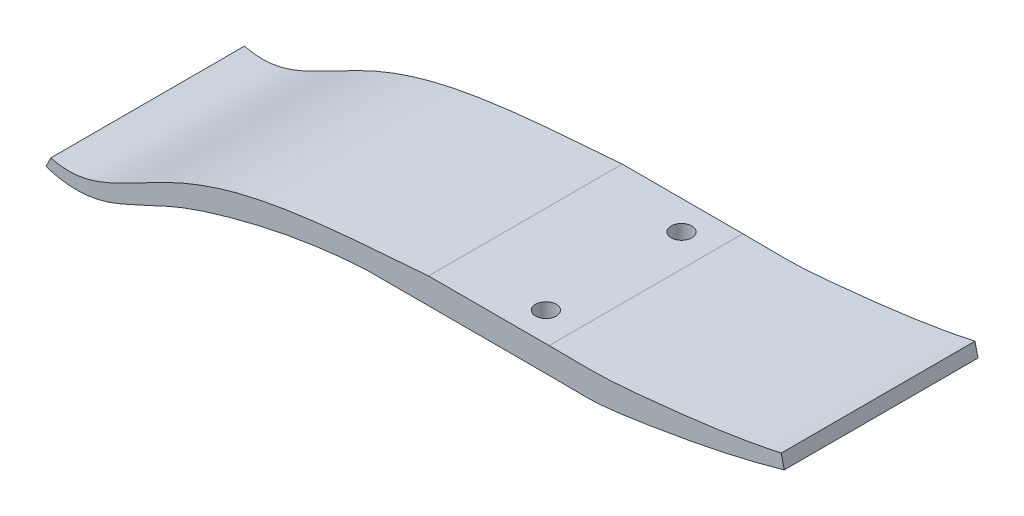
ISO-10303-21;
HEADER;
FILE_DESCRIPTION(('STEP AP214'),'2;1');
FILE_NAME('part.step','',(''),(''),'','','');
FILE_SCHEMA(('AUTOMOTIVE_DESIGN { 1 0 10303 214 1 1 1 1 }'));
ENDSEC;
DATA;
#1=APPLICATION_CONTEXT('core data for automotive mechanical design processes');
#2=APPLICATION_PROTOCOL_DEFINITION('international standard','automotive_design',2000,#1);
#3=PRODUCT_CONTEXT('',#1,'mechanical');
#4=PRODUCT('Part','Part','',(#3));
#5=PRODUCT_RELATED_PRODUCT_CATEGORY('part','',(#4));
#6=PRODUCT_DEFINITION_FORMATION('','',#4);
#7=PRODUCT_DEFINITION_CONTEXT('part definition',#1,'design');
#8=PRODUCT_DEFINITION('design','',#6,#7);
#9=PRODUCT_DEFINITION_SHAPE('','',#8);
#10=(LENGTH_UNIT() NAMED_UNIT(*) SI_UNIT(.MILLI.,.METRE.));
#11=(NAMED_UNIT(*) PLANE_ANGLE_UNIT() SI_UNIT($,.RADIAN.));
#12=(NAMED_UNIT(*) SI_UNIT($,.STERADIAN.) SOLID_ANGLE_UNIT());
#13=UNCERTAINTY_MEASURE_WITH_UNIT(LENGTH_MEASURE(1.E-05),#10,'distance_accuracy_value','');
#14=(GEOMETRIC_REPRESENTATION_CONTEXT(3) GLOBAL_UNCERTAINTY_ASSIGNED_CONTEXT((#13)) GLOBAL_UNIT_ASSIGNED_CONTEXT((#10,
#11,#12)) REPRESENTATION_CONTEXT('',''));
#15=CARTESIAN_POINT('',(0.,0.,0.));
#16=DIRECTION('',(0.,0.,1.));
#17=DIRECTION('',(1.,0.,0.));
#18=AXIS2_PLACEMENT_3D('',#15,#16,#17);
#19=CARTESIAN_POINT('',(0.,-8.,-60.));
#20=DIRECTION('',(0.,-1.,0.));
#21=DIRECTION('',(0.,0.,-1.));
#22=AXIS2_PLACEMENT_3D('',#19,#20,#21);
#23=PLANE('',#22);
#24=CARTESIAN_POINT('',(140.,-8.,-51.));
#25=DIRECTION('',(0.,-1.,0.));
#26=DIRECTION('',(0.,0.,-1.));
#27=AXIS2_PLACEMENT_3D('',#24,#25,#26);
#28=CIRCLE('',#27,3.20000000000001);
#29=CARTESIAN_POINT('',(140.,-8.,-54.2));
#30=VERTEX_POINT('',#29);
#31=EDGE_CURVE('E189',#30,#30,#28,.T.);
#32=ORIENTED_EDGE('',*,*,#31,.F.);
#33=EDGE_LOOP('',(#32));
#34=FACE_BOUND('',#33,.T.);
#35=CARTESIAN_POINT('',(140.,-8.,-9.));
#36=DIRECTION('',(0.,-1.,0.));
#37=DIRECTION('',(0.,0.,-1.));
#38=AXIS2_PLACEMENT_3D('',#35,#36,#37);
#39=CIRCLE('',#38,3.20000000000001);
#40=CARTESIAN_POINT('',(140.,-8.,-12.2));
#41=VERTEX_POINT('',#40);
#42=EDGE_CURVE('E192',#41,#41,#39,.T.);
#43=ORIENTED_EDGE('',*,*,#42,.F.);
#44=EDGE_LOOP('',(#43));
#45=FACE_BOUND('',#44,.T.);
#46=DIRECTION('',(1.,0.,0.));
#47=VECTOR('',#46,1.);
#48=CARTESIAN_POINT('',(0.,-8.,0.));
#49=LINE('',#48,#47);
#50=CARTESIAN_POINT('',(93.176931163352,-8.,0.));
#51=VERTEX_POINT('',#50);
#52=CARTESIAN_POINT('',(150.,-8.,0.));
#53=VERTEX_POINT('',#52);
#54=EDGE_CURVE('E194',#51,#53,#49,.T.);
#55=ORIENTED_EDGE('',*,*,#54,.F.);
#56=DIRECTION('',(0.,0.,1.));
#57=VECTOR('',#56,1.);
#58=CARTESIAN_POINT('',(93.176931163352,-8.,-60.));
#59=LINE('',#58,#57);
#60=CARTESIAN_POINT('',(93.176931163352,-8.,-60.));
#61=VERTEX_POINT('',#60);
#62=EDGE_CURVE('E11',#61,#51,#59,.T.);
#63=ORIENTED_EDGE('',*,*,#62,.F.);
#64=DIRECTION('',(1.,0.,0.));
#65=VECTOR('',#64,1.);
#66=CARTESIAN_POINT('',(0.,-8.,-60.));
#67=LINE('',#66,#65);
#68=CARTESIAN_POINT('',(150.,-8.,-60.));
#69=VERTEX_POINT('',#68);
#70=EDGE_CURVE('E166',#61,#69,#67,.T.);
#71=ORIENTED_EDGE('',*,*,#70,.T.);
#72=DIRECTION('',(0.,0.,1.));
#73=VECTOR('',#72,1.);
#74=CARTESIAN_POINT('',(150.,-8.,-60.));
#75=LINE('',#74,#73);
#76=EDGE_CURVE('E38',#69,#53,#75,.T.);
#77=ORIENTED_EDGE('',*,*,#76,.T.);
#78=EDGE_LOOP('',(#55,#63,#71,#77));
#79=FACE_BOUND('',#78,.T.);
#80=ADVANCED_FACE('F35',(#34,#45,#79),#23,.T.);
#81=CARTESIAN_POINT('',(93.176931163352,-8.,-60.));
#82=CARTESIAN_POINT('',(78.0957969311309,-8.80699461117616,-60.));
#83=CARTESIAN_POINT('',(58.5151825393033,-12.4650925966783,-60.));
#84=CARTESIAN_POINT('',(33.4259032668075,-20.4927879379369,-60.));
#85=CARTESIAN_POINT('',(21.8685661083809,-26.5917525396385,-60.));
#86=CARTESIAN_POINT('',(8.46872535045313,-31.8498980797027,-60.));
#87=CARTESIAN_POINT('',(-0.0208479352188207,-31.917998971666,-60.));
#88=CARTESIAN_POINT('',(-5.81964661908011,-29.8433925816198,-60.));
#89=B_SPLINE_CURVE_WITH_KNOTS('',3,(#81,#82,#83,#84,#85,#86,#87,#88),.UNSPECIFIED.,.F.,.F.,(4,1,
1,1,1,4),(0.,0.439768473969548,0.579665595499106,0.767580001678783,0.820026739006017,1.),.UNSPECIFIED.);
#90=DIRECTION('',(0.,0.,1.));
#91=VECTOR('',#90,1.);
#92=SURFACE_OF_LINEAR_EXTRUSION('',#89,#91);
#93=CARTESIAN_POINT('',(93.176931163352,-8.,0.));
#94=CARTESIAN_POINT('',(78.0957969311309,-8.80699461117616,0.));
#95=CARTESIAN_POINT('',(58.5151825393033,-12.4650925966783,0.));
#96=CARTESIAN_POINT('',(33.4259032668075,-20.4927879379369,0.));
#97=CARTESIAN_POINT('',(21.8685661083809,-26.5917525396385,0.));
#98=CARTESIAN_POINT('',(8.46872535045313,-31.8498980797027,0.));
#99=CARTESIAN_POINT('',(-0.0208479352188207,-31.917998971666,0.));
#100=CARTESIAN_POINT('',(-5.81964661908011,-29.8433925816198,0.));
#101=B_SPLINE_CURVE_WITH_KNOTS('',3,(#93,#94,#95,#96,#97,#98,#99,#100),.UNSPECIFIED.,.F.,.F.,(4,
1,1,1,1,4),(0.,0.439768473969548,0.579665595499106,0.767580001678783,0.820026739006017,1.),.UNSPECIFIED.);
#102=CARTESIAN_POINT('',(-5.81964661908011,-29.8433925816198,0.));
#103=VERTEX_POINT('',#102);
#104=EDGE_CURVE('E80',#51,#103,#101,.T.);
#105=ORIENTED_EDGE('',*,*,#104,.T.);
#106=DIRECTION('',(0.,0.,1.));
#107=VECTOR('',#106,1.);
#108=CARTESIAN_POINT('',(-5.81964661908011,-29.8433925816198,-60.));
#109=LINE('',#108,#107);
#110=CARTESIAN_POINT('',(-5.81964661908011,-29.8433925816198,-60.));
#111=VERTEX_POINT('',#110);
#112=EDGE_CURVE('E44',#111,#103,#109,.T.);
#113=ORIENTED_EDGE('',*,*,#112,.F.);
#114=EDGE_CURVE('E111',#61,#111,#89,.T.);
#115=ORIENTED_EDGE('',*,*,#114,.F.);
#116=ORIENTED_EDGE('',*,*,#62,.T.);
#117=EDGE_LOOP('',(#105,#113,#115,#116));
#118=FACE_BOUND('',#117,.T.);
#119=ADVANCED_FACE('F181',(#118),#92,.F.);
#120=CARTESIAN_POINT('',(7.09491058052405,-3.47488923919436,-60.));
#121=DIRECTION('',(0.898071158471881,-0.439850195317648,0.));
#122=DIRECTION('',(0.439850195317648,0.898071158471881,0.));
#123=AXIS2_PLACEMENT_3D('',#120,#121,#122);
#124=PLANE('',#123);
#125=DIRECTION('',(0.439850195317648,0.898071158471881,0.));
#126=VECTOR('',#125,1.);
#127=CARTESIAN_POINT('',(7.09491058052405,-3.47488923919436,0.));
#128=LINE('',#127,#126);
#129=CARTESIAN_POINT('',(-4.3490721896655,-26.8408237627297,0.));
#130=VERTEX_POINT('',#129);
#131=EDGE_CURVE('E118',#103,#130,#128,.T.);
#132=ORIENTED_EDGE('',*,*,#131,.T.);
#133=DIRECTION('',(0.,0.,1.));
#134=VECTOR('',#133,1.);
#135=CARTESIAN_POINT('',(-4.3490721896655,-26.8408237627297,-60.));
#136=LINE('',#135,#134);
#137=CARTESIAN_POINT('',(-4.3490721896655,-26.8408237627297,-60.));
#138=VERTEX_POINT('',#137);
#139=EDGE_CURVE('E115',#138,#130,#136,.T.);
#140=ORIENTED_EDGE('',*,*,#139,.F.);
#141=DIRECTION('',(0.439850195317648,0.898071158471881,0.));
#142=VECTOR('',#141,1.);
#143=CARTESIAN_POINT('',(7.09491058052405,-3.47488923919436,-60.));
#144=LINE('',#143,#142);
#145=EDGE_CURVE('E105',#111,#138,#144,.T.);
#146=ORIENTED_EDGE('',*,*,#145,.F.);
#147=ORIENTED_EDGE('',*,*,#112,.T.);
#148=EDGE_LOOP('',(#132,#140,#146,#147));
#149=FACE_BOUND('',#148,.T.);
#150=ADVANCED_FACE('F116',(#149),#124,.F.);
#151=CARTESIAN_POINT('',(112.652759777385,0.,-60.));
#152=CARTESIAN_POINT('',(98.2376625749713,-1.17824086350519,-60.));
#153=CARTESIAN_POINT('',(76.3254168453962,-2.36708717832114,-60.));
#154=CARTESIAN_POINT('',(50.3860852112155,-7.71529983443768,-60.));
#155=CARTESIAN_POINT('',(33.0348531791178,-14.2602099703251,-60.));
#156=CARTESIAN_POINT('',(16.9037562336829,-23.4440305371425,-60.));
#157=CARTESIAN_POINT('',(3.82838481165197,-28.9700513852212,-60.));
#158=CARTESIAN_POINT('',(-4.3490721896655,-26.8408237627297,-60.));
#159=B_SPLINE_CURVE_WITH_KNOTS('',3,(#151,#152,#153,#154,#155,#156,#157,#158),.UNSPECIFIED.,.F.,
.F.,(4,1,1,1,1,4),(0.,0.357718306465048,0.541412234617861,0.651991694854041,0.814467727015993,
1.),.UNSPECIFIED.);
#160=DIRECTION('',(0.,0.,1.));
#161=VECTOR('',#160,1.);
#162=SURFACE_OF_LINEAR_EXTRUSION('',#159,#161);
#163=CARTESIAN_POINT('',(112.652759777385,0.,0.));
#164=CARTESIAN_POINT('',(98.2376625749713,-1.17824086350519,0.));
#165=CARTESIAN_POINT('',(76.3254168453962,-2.36708717832114,0.));
#166=CARTESIAN_POINT('',(50.3860852112155,-7.71529983443768,0.));
#167=CARTESIAN_POINT('',(33.0348531791178,-14.2602099703251,0.));
#168=CARTESIAN_POINT('',(16.9037562336829,-23.4440305371425,0.));
#169=CARTESIAN_POINT('',(3.82838481165197,-28.9700513852212,0.));
#170=CARTESIAN_POINT('',(-4.3490721896655,-26.8408237627297,0.));
#171=B_SPLINE_CURVE_WITH_KNOTS('',3,(#163,#164,#165,#166,#167,#168,#169,#170),.UNSPECIFIED.,.F.,
.F.,(4,1,1,1,1,4),(0.,0.357718306465048,0.541412234617861,0.651991694854041,0.814467727015993,
1.),.UNSPECIFIED.);
#172=CARTESIAN_POINT('',(112.652759777385,0.,0.));
#173=VERTEX_POINT('',#172);
#174=EDGE_CURVE('E221',#173,#130,#171,.T.);
#175=ORIENTED_EDGE('',*,*,#174,.F.);
#176=DIRECTION('',(0.,0.,1.));
#177=VECTOR('',#176,1.);
#178=CARTESIAN_POINT('',(112.652759777385,0.,-60.));
#179=LINE('',#178,#177);
#180=CARTESIAN_POINT('',(112.652759777385,0.,-60.));
#181=VERTEX_POINT('',#180);
#182=EDGE_CURVE('E122',#181,#173,#179,.T.);
#183=ORIENTED_EDGE('',*,*,#182,.F.);
#184=EDGE_CURVE('E110',#181,#138,#159,.T.);
#185=ORIENTED_EDGE('',*,*,#184,.T.);
#186=ORIENTED_EDGE('',*,*,#139,.T.);
#187=EDGE_LOOP('',(#175,#183,#185,#186));
#188=FACE_BOUND('',#187,.T.);
#189=ADVANCED_FACE('F124',(#188),#162,.T.);
#190=CARTESIAN_POINT('',(0.,0.,-60.));
#191=DIRECTION('',(0.,-1.,0.));
#192=DIRECTION('',(0.,0.,-1.));
#193=AXIS2_PLACEMENT_3D('',#190,#191,#192);
#194=PLANE('',#193);
#195=CARTESIAN_POINT('',(140.,0.,-51.));
#196=DIRECTION('',(0.,1.,0.));
#197=DIRECTION('',(0.,0.,1.));
#198=AXIS2_PLACEMENT_3D('',#195,#196,#197);
#199=CIRCLE('',#198,3.20000000000001);
#200=CARTESIAN_POINT('',(140.,0.,-47.8));
#201=VERTEX_POINT('',#200);
#202=EDGE_CURVE('E265',#201,#201,#199,.T.);
#203=ORIENTED_EDGE('',*,*,#202,.F.);
#204=EDGE_LOOP('',(#203));
#205=FACE_BOUND('',#204,.T.);
#206=CARTESIAN_POINT('',(140.,0.,-9.));
#207=DIRECTION('',(0.,1.,0.));
#208=DIRECTION('',(0.,0.,-1.));
#209=AXIS2_PLACEMENT_3D('',#206,#207,#208);
#210=CIRCLE('',#209,3.20000000000001);
#211=CARTESIAN_POINT('',(140.,0.,-12.2));
#212=VERTEX_POINT('',#211);
#213=EDGE_CURVE('E266',#212,#212,#210,.T.);
#214=ORIENTED_EDGE('',*,*,#213,.F.);
#215=EDGE_LOOP('',(#214));
#216=FACE_BOUND('',#215,.T.);
#217=DIRECTION('',(1.,0.,0.));
#218=VECTOR('',#217,1.);
#219=CARTESIAN_POINT('',(0.,0.,0.));
#220=LINE('',#219,#218);
#221=CARTESIAN_POINT('',(150.,0.,0.));
#222=VERTEX_POINT('',#221);
#223=EDGE_CURVE('E216',#173,#222,#220,.T.);
#224=ORIENTED_EDGE('',*,*,#223,.T.);
#225=DIRECTION('',(0.,0.,1.));
#226=VECTOR('',#225,1.);
#227=CARTESIAN_POINT('',(150.,0.,-60.));
#228=LINE('',#227,#226);
#229=CARTESIAN_POINT('',(150.,0.,-60.));
#230=VERTEX_POINT('',#229);
#231=EDGE_CURVE('E237',#230,#222,#228,.T.);
#232=ORIENTED_EDGE('',*,*,#231,.F.);
#233=DIRECTION('',(1.,0.,0.));
#234=VECTOR('',#233,1.);
#235=CARTESIAN_POINT('',(0.,0.,-60.));
#236=LINE('',#235,#234);
#237=EDGE_CURVE('E126',#181,#230,#236,.T.);
#238=ORIENTED_EDGE('',*,*,#237,.F.);
#239=ORIENTED_EDGE('',*,*,#182,.T.);
#240=EDGE_LOOP('',(#224,#232,#238,#239));
#241=FACE_BOUND('',#240,.T.);
#242=ADVANCED_FACE('F142',(#205,#216,#241),#194,.F.);
#243=CARTESIAN_POINT('',(150.,0.,-60.));
#244=CARTESIAN_POINT('',(155.186432148662,-0.0718742615372908,-60.));
#245=CARTESIAN_POINT('',(162.776030142511,-0.192676417750502,-60.));
#246=CARTESIAN_POINT('',(171.942529729798,0.198053168123687,-60.));
#247=CARTESIAN_POINT('',(191.054206550656,2.04232939593167,-60.));
#248=CARTESIAN_POINT('',(208.370998680919,4.16092666138683,-60.));
#249=CARTESIAN_POINT('',(221.895107653853,7.1301475869862,-60.));
#250=B_SPLINE_CURVE_WITH_KNOTS('',3,(#243,#244,#245,#246,#247,#248,#249),.UNSPECIFIED.,.F.,.F.,
(4,1,1,1,4),(0.,0.18051348265581,0.221559147826025,0.410456651702149,1.),.UNSPECIFIED.);
#251=DIRECTION('',(0.,0.,1.));
#252=VECTOR('',#251,1.);
#253=SURFACE_OF_LINEAR_EXTRUSION('',#250,#252);
#254=CARTESIAN_POINT('',(150.,0.,0.));
#255=CARTESIAN_POINT('',(155.186432148662,-0.0718742615372908,0.));
#256=CARTESIAN_POINT('',(162.776030142511,-0.192676417750502,0.));
#257=CARTESIAN_POINT('',(171.942529729798,0.198053168123687,0.));
#258=CARTESIAN_POINT('',(191.054206550656,2.04232939593167,0.));
#259=CARTESIAN_POINT('',(208.370998680919,4.16092666138683,0.));
#260=CARTESIAN_POINT('',(221.895107653853,7.1301475869862,0.));
#261=B_SPLINE_CURVE_WITH_KNOTS('',3,(#254,#255,#256,#257,#258,#259,#260),.UNSPECIFIED.,.F.,.F.,
(4,1,1,1,4),(0.,0.18051348265581,0.221559147826025,0.410456651702149,1.),.UNSPECIFIED.);
#262=CARTESIAN_POINT('',(221.895107653853,7.1301475869862,0.));
#263=VERTEX_POINT('',#262);
#264=EDGE_CURVE('E212',#222,#263,#261,.T.);
#265=ORIENTED_EDGE('',*,*,#264,.T.);
#266=DIRECTION('',(0.,0.,1.));
#267=VECTOR('',#266,1.);
#268=CARTESIAN_POINT('',(221.895107653853,7.1301475869862,-60.));
#269=LINE('',#268,#267);
#270=CARTESIAN_POINT('',(221.895107653853,7.1301475869862,-60.));
#271=VERTEX_POINT('',#270);
#272=EDGE_CURVE('E240',#271,#263,#269,.T.);
#273=ORIENTED_EDGE('',*,*,#272,.F.);
#274=EDGE_CURVE('E128',#230,#271,#250,.T.);
#275=ORIENTED_EDGE('',*,*,#274,.F.);
#276=ORIENTED_EDGE('',*,*,#231,.T.);
#277=EDGE_LOOP('',(#265,#273,#275,#276));
#278=FACE_BOUND('',#277,.T.);
#279=ADVANCED_FACE('F146',(#278),#253,.F.);
#280=CARTESIAN_POINT('',(212.431935761197,48.54273129976,-60.));
#281=DIRECTION('',(-0.974871603316668,-0.222767495489778,0.));
#282=DIRECTION('',(0.222767495489778,-0.974871603316669,0.));
#283=AXIS2_PLACEMENT_3D('',#280,#281,#282);
#284=PLANE('',#283);
#285=DIRECTION('',(0.222767495489778,-0.974871603316668,0.));
#286=VECTOR('',#285,1.);
#287=CARTESIAN_POINT('',(212.431935761197,48.54273129976,0.));
#288=LINE('',#287,#286);
#289=CARTESIAN_POINT('',(222.824656402166,3.06227100276661,0.));
#290=VERTEX_POINT('',#289);
#291=EDGE_CURVE('E199',#263,#290,#288,.T.);
#292=ORIENTED_EDGE('',*,*,#291,.T.);
#293=DIRECTION('',(0.,0.,1.));
#294=VECTOR('',#293,1.);
#295=CARTESIAN_POINT('',(222.824656402166,3.06227100276661,-60.));
#296=LINE('',#295,#294);
#297=CARTESIAN_POINT('',(222.824656402166,3.06227100276661,-60.));
#298=VERTEX_POINT('',#297);
#299=EDGE_CURVE('E242',#298,#290,#296,.T.);
#300=ORIENTED_EDGE('',*,*,#299,.F.);
#301=DIRECTION('',(0.222767495489778,-0.974871603316668,0.));
#302=VECTOR('',#301,1.);
#303=CARTESIAN_POINT('',(212.431935761197,48.54273129976,-60.));
#304=LINE('',#303,#302);
#305=EDGE_CURVE('E156',#271,#298,#304,.T.);
#306=ORIENTED_EDGE('',*,*,#305,.F.);
#307=ORIENTED_EDGE('',*,*,#272,.T.);
#308=EDGE_LOOP('',(#292,#300,#306,#307));
#309=FACE_BOUND('',#308,.T.);
#310=ADVANCED_FACE('F150',(#309),#284,.F.);
#311=CARTESIAN_POINT('',(150.,-8.,-60.));
#312=CARTESIAN_POINT('',(160.934675430648,-8.17850057219772,-60.));
#313=CARTESIAN_POINT('',(167.732636415553,-7.98140323484132,-60.));
#314=CARTESIAN_POINT('',(191.21818304385,-4.40065716712356,-60.));
#315=CARTESIAN_POINT('',(208.863871924255,-0.95796019302647,-60.));
#316=CARTESIAN_POINT('',(222.824656402166,3.06227100276661,-60.));
#317=B_SPLINE_CURVE_WITH_KNOTS('',3,(#311,#312,#313,#314,#315,#316),.UNSPECIFIED.,.F.,.F.,(4,1,
1,4),(0.,0.132806244445961,0.367168857757371,1.),.UNSPECIFIED.);
#318=DIRECTION('',(0.,0.,1.));
#319=VECTOR('',#318,1.);
#320=SURFACE_OF_LINEAR_EXTRUSION('',#317,#319);
#321=CARTESIAN_POINT('',(150.,-8.,0.));
#322=CARTESIAN_POINT('',(160.934675430648,-8.17850057219772,0.));
#323=CARTESIAN_POINT('',(167.732636415553,-7.98140323484132,0.));
#324=CARTESIAN_POINT('',(191.21818304385,-4.40065716712356,0.));
#325=CARTESIAN_POINT('',(208.863871924255,-0.95796019302647,0.));
#326=CARTESIAN_POINT('',(222.824656402166,3.06227100276661,0.));
#327=B_SPLINE_CURVE_WITH_KNOTS('',3,(#321,#322,#323,#324,#325,#326),.UNSPECIFIED.,.F.,.F.,(4,1,
1,4),(0.,0.132806244445961,0.367168857757371,1.),.UNSPECIFIED.);
#328=EDGE_CURVE('E197',#53,#290,#327,.T.);
#329=ORIENTED_EDGE('',*,*,#328,.F.);
#330=ORIENTED_EDGE('',*,*,#76,.F.);
#331=EDGE_CURVE('E161',#69,#298,#317,.T.);
#332=ORIENTED_EDGE('',*,*,#331,.T.);
#333=ORIENTED_EDGE('',*,*,#299,.T.);
#334=EDGE_LOOP('',(#329,#330,#332,#333));
#335=FACE_BOUND('',#334,.T.);
#336=ADVANCED_FACE('F171',(#335),#320,.T.);
#337=CARTESIAN_POINT('',(0.,0.,-60.));
#338=DIRECTION('',(0.,0.,1.));
#339=DIRECTION('',(1.,0.,0.));
#340=AXIS2_PLACEMENT_3D('',#337,#338,#339);
#341=PLANE('',#340);
#342=ORIENTED_EDGE('',*,*,#70,.F.);
#343=ORIENTED_EDGE('',*,*,#114,.T.);
#344=ORIENTED_EDGE('',*,*,#145,.T.);
#345=ORIENTED_EDGE('',*,*,#184,.F.);
#346=ORIENTED_EDGE('',*,*,#237,.T.);
#347=ORIENTED_EDGE('',*,*,#274,.T.);
#348=ORIENTED_EDGE('',*,*,#305,.T.);
#349=ORIENTED_EDGE('',*,*,#331,.F.);
#350=EDGE_LOOP('',(#342,#343,#344,#345,#346,#347,#348,#349));
#351=FACE_BOUND('',#350,.T.);
#352=ADVANCED_FACE('F108',(#351),#341,.F.);
#353=CARTESIAN_POINT('',(0.,0.,0.));
#354=DIRECTION('',(0.,0.,1.));
#355=DIRECTION('',(1.,0.,0.));
#356=AXIS2_PLACEMENT_3D('',#353,#354,#355);
#357=PLANE('',#356);
#358=ORIENTED_EDGE('',*,*,#54,.T.);
#359=ORIENTED_EDGE('',*,*,#328,.T.);
#360=ORIENTED_EDGE('',*,*,#291,.F.);
#361=ORIENTED_EDGE('',*,*,#264,.F.);
#362=ORIENTED_EDGE('',*,*,#223,.F.);
#363=ORIENTED_EDGE('',*,*,#174,.T.);
#364=ORIENTED_EDGE('',*,*,#131,.F.);
#365=ORIENTED_EDGE('',*,*,#104,.F.);
#366=EDGE_LOOP('',(#358,#359,#360,#361,#362,#363,#364,#365));
#367=FACE_BOUND('',#366,.T.);
#368=ADVANCED_FACE('F177',(#367),#357,.T.);
#369=CARTESIAN_POINT('',(140.,-31.917998971666,-9.));
#370=DIRECTION('',(0.,1.,0.));
#371=DIRECTION('',(0.,0.,1.));
#372=AXIS2_PLACEMENT_3D('',#369,#370,#371);
#373=CYLINDRICAL_SURFACE('',#372,3.20000000000001);
#374=ORIENTED_EDGE('',*,*,#42,.T.);
#375=EDGE_LOOP('',(#374));
#376=FACE_BOUND('',#375,.T.);
#377=ORIENTED_EDGE('',*,*,#213,.T.);
#378=EDGE_LOOP('',(#377));
#379=FACE_BOUND('',#378,.T.);
#380=ADVANCED_FACE('F249',(#376,#379),#373,.F.);
#381=CARTESIAN_POINT('',(140.,-31.917998971666,-51.));
#382=DIRECTION('',(0.,1.,0.));
#383=DIRECTION('',(0.,0.,1.));
#384=AXIS2_PLACEMENT_3D('',#381,#382,#383);
#385=CYLINDRICAL_SURFACE('',#384,3.20000000000001);
#386=ORIENTED_EDGE('',*,*,#31,.T.);
#387=EDGE_LOOP('',(#386));
#388=FACE_BOUND('',#387,.T.);
#389=ORIENTED_EDGE('',*,*,#202,.T.);
#390=EDGE_LOOP('',(#389));
#391=FACE_BOUND('',#390,.T.);
#392=ADVANCED_FACE('F254',(#388,#391),#385,.F.);
#393=CLOSED_SHELL('',(#80,#119,#150,#189,#242,#279,#310,#336,#352,#368,#380,#392));
#394=MANIFOLD_SOLID_BREP('B2',#393);
#395=ADVANCED_BREP_SHAPE_REPRESENTATION('',(#18,#394),#14);
#396=SHAPE_DEFINITION_REPRESENTATION(#9,#395);
ENDSEC;
END-ISO-10303-21;
